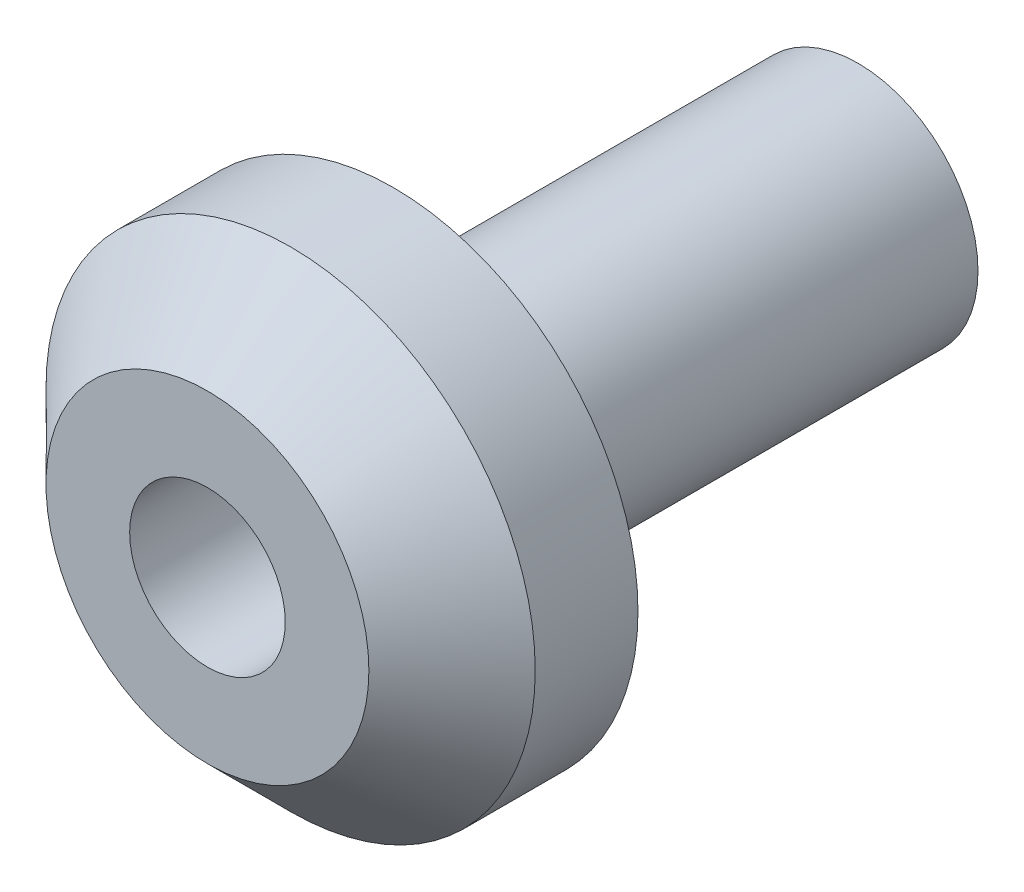
ISO-10303-21;
HEADER;
FILE_DESCRIPTION(('STEP AP214'),'2;1');
FILE_NAME('part.step','',(''),(''),'','','');
FILE_SCHEMA(('AUTOMOTIVE_DESIGN { 1 0 10303 214 1 1 1 1 }'));
ENDSEC;
DATA;
#1=APPLICATION_CONTEXT('core data for automotive mechanical design processes');
#2=APPLICATION_PROTOCOL_DEFINITION('international standard','automotive_design',2000,#1);
#3=PRODUCT_CONTEXT('',#1,'mechanical');
#4=PRODUCT('Part','Part','',(#3));
#5=PRODUCT_RELATED_PRODUCT_CATEGORY('part','',(#4));
#6=PRODUCT_DEFINITION_FORMATION('','',#4);
#7=PRODUCT_DEFINITION_CONTEXT('part definition',#1,'design');
#8=PRODUCT_DEFINITION('design','',#6,#7);
#9=PRODUCT_DEFINITION_SHAPE('','',#8);
#10=(LENGTH_UNIT() NAMED_UNIT(*) SI_UNIT(.MILLI.,.METRE.));
#11=(NAMED_UNIT(*) PLANE_ANGLE_UNIT() SI_UNIT($,.RADIAN.));
#12=(NAMED_UNIT(*) SI_UNIT($,.STERADIAN.) SOLID_ANGLE_UNIT());
#13=UNCERTAINTY_MEASURE_WITH_UNIT(LENGTH_MEASURE(1.E-05),#10,'distance_accuracy_value','');
#14=(GEOMETRIC_REPRESENTATION_CONTEXT(3) GLOBAL_UNCERTAINTY_ASSIGNED_CONTEXT((#13)) GLOBAL_UNIT_ASSIGNED_CONTEXT((#10,
#11,#12)) REPRESENTATION_CONTEXT('',''));
#15=CARTESIAN_POINT('',(0.,0.,0.));
#16=DIRECTION('',(0.,0.,1.));
#17=DIRECTION('',(1.,0.,0.));
#18=AXIS2_PLACEMENT_3D('',#15,#16,#17);
#19=CARTESIAN_POINT('',(0.,0.,0.));
#20=DIRECTION('',(0.,0.,1.));
#21=DIRECTION('',(1.,0.,0.));
#22=AXIS2_PLACEMENT_3D('',#19,#20,#21);
#23=PLANE('',#22);
#24=CARTESIAN_POINT('',(0.,0.,0.));
#25=DIRECTION('',(0.,0.,1.));
#26=DIRECTION('',(1.,0.,0.));
#27=AXIS2_PLACEMENT_3D('',#24,#25,#26);
#28=CIRCLE('',#27,12.7);
#29=CARTESIAN_POINT('',(12.7,0.,0.));
#30=VERTEX_POINT('',#29);
#31=EDGE_CURVE('E46',#30,#30,#28,.T.);
#32=ORIENTED_EDGE('',*,*,#31,.F.);
#33=EDGE_LOOP('',(#32));
#34=FACE_BOUND('',#33,.T.);
#35=CARTESIAN_POINT('',(0.,0.,0.));
#36=DIRECTION('',(0.,0.,1.));
#37=DIRECTION('',(1.,0.,0.));
#38=AXIS2_PLACEMENT_3D('',#35,#36,#37);
#39=CIRCLE('',#38,6.223);
#40=CARTESIAN_POINT('',(6.223,0.,0.));
#41=VERTEX_POINT('',#40);
#42=EDGE_CURVE('E42',#41,#41,#39,.F.);
#43=ORIENTED_EDGE('',*,*,#42,.F.);
#44=EDGE_LOOP('',(#43));
#45=FACE_BOUND('',#44,.T.);
#46=ADVANCED_FACE('F31',(#34,#45),#23,.F.);
#47=CARTESIAN_POINT('',(0.,0.,9.652));
#48=DIRECTION('',(0.,0.,1.));
#49=DIRECTION('',(1.,0.,0.));
#50=AXIS2_PLACEMENT_3D('',#47,#48,#49);
#51=PLANE('',#50);
#52=CARTESIAN_POINT('',(0.,0.,9.652));
#53=DIRECTION('',(0.,0.,1.));
#54=DIRECTION('',(1.,0.,0.));
#55=AXIS2_PLACEMENT_3D('',#52,#53,#54);
#56=CIRCLE('',#55,8.38199999999999);
#57=CARTESIAN_POINT('',(8.38199999999999,0.,9.652));
#58=VERTEX_POINT('',#57);
#59=EDGE_CURVE('E38',#58,#58,#56,.T.);
#60=ORIENTED_EDGE('',*,*,#59,.T.);
#61=EDGE_LOOP('',(#60));
#62=FACE_BOUND('',#61,.T.);
#63=CARTESIAN_POINT('',(0.,0.,9.652));
#64=DIRECTION('',(0.,0.,1.));
#65=DIRECTION('',(1.,0.,0.));
#66=AXIS2_PLACEMENT_3D('',#63,#64,#65);
#67=CIRCLE('',#66,4.0386);
#68=CARTESIAN_POINT('',(4.0386,0.,9.652));
#69=VERTEX_POINT('',#68);
#70=EDGE_CURVE('E51',#69,#69,#67,.T.);
#71=ORIENTED_EDGE('',*,*,#70,.F.);
#72=EDGE_LOOP('',(#71));
#73=FACE_BOUND('',#72,.T.);
#74=ADVANCED_FACE('F78',(#62,#73),#51,.T.);
#75=CARTESIAN_POINT('',(0.,0.,9.652));
#76=DIRECTION('',(0.,0.,-1.));
#77=DIRECTION('',(-1.,0.,0.));
#78=AXIS2_PLACEMENT_3D('',#75,#76,#77);
#79=CYLINDRICAL_SURFACE('',#78,12.7);
#80=CARTESIAN_POINT('',(0.,0.,5.33399999999997));
#81=DIRECTION('',(0.,0.,1.));
#82=DIRECTION('',(1.,0.,0.));
#83=AXIS2_PLACEMENT_3D('',#80,#81,#82);
#84=CIRCLE('',#83,12.7);
#85=CARTESIAN_POINT('',(12.7,0.,5.33399999999997));
#86=VERTEX_POINT('',#85);
#87=EDGE_CURVE('E10',#86,#86,#84,.F.);
#88=ORIENTED_EDGE('',*,*,#87,.T.);
#89=EDGE_LOOP('',(#88));
#90=FACE_BOUND('',#89,.T.);
#91=ORIENTED_EDGE('',*,*,#31,.T.);
#92=EDGE_LOOP('',(#91));
#93=FACE_BOUND('',#92,.T.);
#94=ADVANCED_FACE('F74',(#90,#93),#79,.T.);
#95=CARTESIAN_POINT('',(0.,0.,9.652));
#96=DIRECTION('',(0.,0.,-1.));
#97=DIRECTION('',(-1.,0.,0.));
#98=AXIS2_PLACEMENT_3D('',#95,#96,#97);
#99=CYLINDRICAL_SURFACE('',#98,4.0386);
#100=ORIENTED_EDGE('',*,*,#70,.T.);
#101=EDGE_LOOP('',(#100));
#102=FACE_BOUND('',#101,.T.);
#103=CARTESIAN_POINT('',(0.,0.,-24.13));
#104=DIRECTION('',(0.,0.,-1.));
#105=DIRECTION('',(-1.,0.,0.));
#106=AXIS2_PLACEMENT_3D('',#103,#104,#105);
#107=CIRCLE('',#106,4.0386);
#108=CARTESIAN_POINT('',(-4.0386,0.,-24.13));
#109=VERTEX_POINT('',#108);
#110=EDGE_CURVE('E57',#109,#109,#107,.T.);
#111=ORIENTED_EDGE('',*,*,#110,.T.);
#112=EDGE_LOOP('',(#111));
#113=FACE_BOUND('',#112,.T.);
#114=ADVANCED_FACE('F61',(#102,#113),#99,.F.);
#115=CARTESIAN_POINT('',(0.,0.,-24.13));
#116=DIRECTION('',(0.,0.,-1.));
#117=DIRECTION('',(-1.,0.,0.));
#118=AXIS2_PLACEMENT_3D('',#115,#116,#117);
#119=PLANE('',#118);
#120=CARTESIAN_POINT('',(0.,0.,-24.13));
#121=DIRECTION('',(0.,0.,-1.));
#122=DIRECTION('',(-1.,0.,0.));
#123=AXIS2_PLACEMENT_3D('',#120,#121,#122);
#124=CIRCLE('',#123,6.223);
#125=CARTESIAN_POINT('',(6.223,0.,-24.13));
#126=VERTEX_POINT('',#125);
#127=EDGE_CURVE('E54',#126,#126,#124,.T.);
#128=ORIENTED_EDGE('',*,*,#127,.T.);
#129=EDGE_LOOP('',(#128));
#130=FACE_BOUND('',#129,.T.);
#131=ORIENTED_EDGE('',*,*,#110,.F.);
#132=EDGE_LOOP('',(#131));
#133=FACE_BOUND('',#132,.T.);
#134=ADVANCED_FACE('F63',(#130,#133),#119,.T.);
#135=CARTESIAN_POINT('',(0.,0.,-24.13));
#136=DIRECTION('',(0.,0.,1.));
#137=DIRECTION('',(1.,0.,0.));
#138=AXIS2_PLACEMENT_3D('',#135,#136,#137);
#139=CYLINDRICAL_SURFACE('',#138,6.223);
#140=CARTESIAN_POINT('',(6.223,0.,-24.13));
#141=CARTESIAN_POINT('',(6.223,0.,-23.8786458333333));
#142=CARTESIAN_POINT('',(6.223,0.,-23.6272916666667));
#143=CARTESIAN_POINT('',(6.223,0.,-23.1245833333333));
#144=CARTESIAN_POINT('',(6.223,0.,-22.8732291666667));
#145=CARTESIAN_POINT('',(6.223,0.,-22.3705208333333));
#146=CARTESIAN_POINT('',(6.223,0.,-22.1191666666667));
#147=CARTESIAN_POINT('',(6.223,0.,-21.6164583333333));
#148=CARTESIAN_POINT('',(6.223,0.,-21.3651041666667));
#149=CARTESIAN_POINT('',(6.223,0.,-20.8623958333333));
#150=CARTESIAN_POINT('',(6.223,0.,-20.6110416666667));
#151=CARTESIAN_POINT('',(6.223,0.,-20.1083333333333));
#152=CARTESIAN_POINT('',(6.223,0.,-19.8569791666667));
#153=CARTESIAN_POINT('',(6.223,0.,-19.3542708333333));
#154=CARTESIAN_POINT('',(6.223,0.,-19.1029166666667));
#155=CARTESIAN_POINT('',(6.223,0.,-18.6002083333333));
#156=CARTESIAN_POINT('',(6.223,0.,-18.3488541666667));
#157=CARTESIAN_POINT('',(6.223,0.,-17.8461458333333));
#158=CARTESIAN_POINT('',(6.223,0.,-17.5947916666667));
#159=CARTESIAN_POINT('',(6.223,0.,-17.0920833333333));
#160=CARTESIAN_POINT('',(6.223,0.,-16.8407291666667));
#161=CARTESIAN_POINT('',(6.223,0.,-16.3380208333333));
#162=CARTESIAN_POINT('',(6.223,0.,-16.0866666666667));
#163=CARTESIAN_POINT('',(6.223,0.,-15.5839583333333));
#164=CARTESIAN_POINT('',(6.223,0.,-15.3326041666667));
#165=CARTESIAN_POINT('',(6.223,0.,-14.8298958333333));
#166=CARTESIAN_POINT('',(6.223,0.,-14.5785416666667));
#167=CARTESIAN_POINT('',(6.223,0.,-14.0758333333333));
#168=CARTESIAN_POINT('',(6.223,0.,-13.8244791666667));
#169=CARTESIAN_POINT('',(6.223,0.,-13.3217708333333));
#170=CARTESIAN_POINT('',(6.223,0.,-13.0704166666667));
#171=CARTESIAN_POINT('',(6.223,0.,-12.5677083333333));
#172=CARTESIAN_POINT('',(6.223,0.,-12.3163541666667));
#173=CARTESIAN_POINT('',(6.223,0.,-11.8136458333333));
#174=CARTESIAN_POINT('',(6.223,0.,-11.5622916666667));
#175=CARTESIAN_POINT('',(6.223,0.,-11.0595833333333));
#176=CARTESIAN_POINT('',(6.223,0.,-10.8082291666667));
#177=CARTESIAN_POINT('',(6.223,0.,-10.3055208333333));
#178=CARTESIAN_POINT('',(6.223,0.,-10.0541666666667));
#179=CARTESIAN_POINT('',(6.223,0.,-9.55145833333333));
#180=CARTESIAN_POINT('',(6.223,0.,-9.30010416666667));
#181=CARTESIAN_POINT('',(6.223,0.,-8.79739583333333));
#182=CARTESIAN_POINT('',(6.223,0.,-8.54604166666667));
#183=CARTESIAN_POINT('',(6.223,0.,-8.04333333333333));
#184=CARTESIAN_POINT('',(6.223,0.,-7.79197916666667));
#185=CARTESIAN_POINT('',(6.223,0.,-7.28927083333334));
#186=CARTESIAN_POINT('',(6.223,0.,-7.03791666666667));
#187=CARTESIAN_POINT('',(6.223,0.,-6.53520833333334));
#188=CARTESIAN_POINT('',(6.223,0.,-6.28385416666667));
#189=CARTESIAN_POINT('',(6.223,0.,-5.78114583333334));
#190=CARTESIAN_POINT('',(6.223,0.,-5.52979166666667));
#191=CARTESIAN_POINT('',(6.223,0.,-5.02708333333334));
#192=CARTESIAN_POINT('',(6.223,0.,-4.77572916666667));
#193=CARTESIAN_POINT('',(6.223,0.,-4.27302083333334));
#194=CARTESIAN_POINT('',(6.223,0.,-4.02166666666667));
#195=CARTESIAN_POINT('',(6.223,0.,-3.51895833333334));
#196=CARTESIAN_POINT('',(6.223,0.,-3.26760416666667));
#197=CARTESIAN_POINT('',(6.223,0.,-2.76489583333333));
#198=CARTESIAN_POINT('',(6.223,0.,-2.51354166666667));
#199=CARTESIAN_POINT('',(6.223,0.,-2.01083333333334));
#200=CARTESIAN_POINT('',(6.223,0.,-1.75947916666667));
#201=CARTESIAN_POINT('',(6.223,0.,-1.25677083333334));
#202=CARTESIAN_POINT('',(6.223,0.,-1.00541666666667));
#203=CARTESIAN_POINT('',(6.223,0.,-0.502708333333336));
#204=CARTESIAN_POINT('',(6.223,0.,-0.25135416666667));
#205=CARTESIAN_POINT('',(6.223,0.,0.));
#206=B_SPLINE_CURVE_WITH_KNOTS('',3,(#140,#141,#142,#143,#144,#145,#146,#147,#148,#149,#150,
#151,#152,#153,#154,#155,#156,#157,#158,#159,#160,#161,#162,#163,#164,#165,#166,#167,#168,#169,
#170,#171,#172,#173,#174,#175,#176,#177,#178,#179,#180,#181,#182,#183,#184,#185,#186,#187,#188,
#189,#190,#191,#192,#193,#194,#195,#196,#197,#198,#199,#200,#201,#202,#203,#204,#205),
.UNSPECIFIED.,.F.,.F.,(4,2,2,2,2,2,2,2,2,2,2,2,2,2,2,2,2,2,2,2,2,2,2,2,2,2,2,2,2,2,2,2,4),(0.,
0.754062500000003,1.508125,2.2621875,3.01625,3.7703125,4.524375,5.2784375,6.0325,6.7865625,
7.540625,8.2946875,9.04875,9.8028125,10.556875,11.3109375,12.065,12.8190625,13.573125,
14.3271875,15.08125,15.8353125,16.589375,17.3434375,18.0975,18.8515625,19.605625,20.3596875,
21.11375,21.8678125,22.621875,23.3759375,24.13),.UNSPECIFIED.);
#207=EDGE_CURVE('BSEAM65',#126,#41,#206,.T.);
#208=ORIENTED_EDGE('',*,*,#127,.F.);
#209=ORIENTED_EDGE('',*,*,#42,.T.);
#210=ORIENTED_EDGE('',*,*,#207,.T.);
#211=ORIENTED_EDGE('',*,*,#207,.F.);
#212=EDGE_LOOP('',(#208,#210,#209,#211));
#213=FACE_BOUND('',#212,.T.);
#214=ADVANCED_FACE('F65',(#213),#139,.T.);
#215=CARTESIAN_POINT('',(0.,0.,9.652));
#216=DIRECTION('',(0.,0.,-1.));
#217=DIRECTION('',(-1.,0.,0.));
#218=AXIS2_PLACEMENT_3D('',#215,#216,#217);
#219=CONICAL_SURFACE('',#218,8.38199999999999,0.785398163397446);
#220=ORIENTED_EDGE('',*,*,#87,.F.);
#221=EDGE_LOOP('',(#220));
#222=FACE_BOUND('',#221,.T.);
#223=ORIENTED_EDGE('',*,*,#59,.F.);
#224=EDGE_LOOP('',(#223));
#225=FACE_BOUND('',#224,.T.);
#226=ADVANCED_FACE('F33',(#222,#225),#219,.T.);
#227=CLOSED_SHELL('',(#46,#74,#94,#114,#134,#214,#226));
#228=MANIFOLD_SOLID_BREP('B2',#227);
#229=ADVANCED_BREP_SHAPE_REPRESENTATION('',(#18,#228),#14);
#230=SHAPE_DEFINITION_REPRESENTATION(#9,#229);
ENDSEC;
END-ISO-10303-21;
